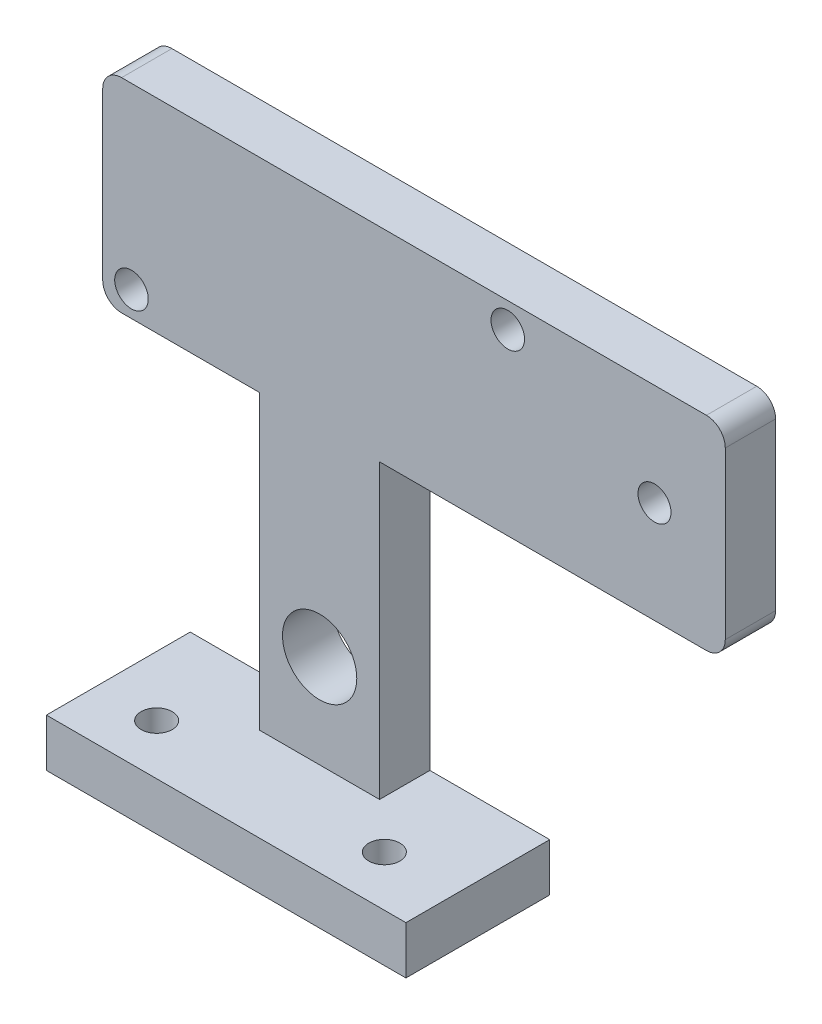
ISO-10303-21;
HEADER;
FILE_DESCRIPTION(('STEP AP214'),'2;1');
FILE_NAME('part.step','',(''),(''),'','','');
FILE_SCHEMA(('AUTOMOTIVE_DESIGN { 1 0 10303 214 1 1 1 1 }'));
ENDSEC;
DATA;
#1=APPLICATION_CONTEXT('core data for automotive mechanical design processes');
#2=APPLICATION_PROTOCOL_DEFINITION('international standard','automotive_design',2000,#1);
#3=PRODUCT_CONTEXT('',#1,'mechanical');
#4=PRODUCT('Part','Part','',(#3));
#5=PRODUCT_RELATED_PRODUCT_CATEGORY('part','',(#4));
#6=PRODUCT_DEFINITION_FORMATION('','',#4);
#7=PRODUCT_DEFINITION_CONTEXT('part definition',#1,'design');
#8=PRODUCT_DEFINITION('design','',#6,#7);
#9=PRODUCT_DEFINITION_SHAPE('','',#8);
#10=(LENGTH_UNIT() NAMED_UNIT(*) SI_UNIT(.MILLI.,.METRE.));
#11=(NAMED_UNIT(*) PLANE_ANGLE_UNIT() SI_UNIT($,.RADIAN.));
#12=(NAMED_UNIT(*) SI_UNIT($,.STERADIAN.) SOLID_ANGLE_UNIT());
#13=UNCERTAINTY_MEASURE_WITH_UNIT(LENGTH_MEASURE(1.E-05),#10,'distance_accuracy_value','');
#14=(GEOMETRIC_REPRESENTATION_CONTEXT(3) GLOBAL_UNCERTAINTY_ASSIGNED_CONTEXT((#13)) GLOBAL_UNIT_ASSIGNED_CONTEXT((#10,
#11,#12)) REPRESENTATION_CONTEXT('',''));
#15=CARTESIAN_POINT('',(0.,0.,0.));
#16=DIRECTION('',(0.,0.,1.));
#17=DIRECTION('',(1.,0.,0.));
#18=AXIS2_PLACEMENT_3D('',#15,#16,#17);
#19=CARTESIAN_POINT('',(-100.96160810836,-5.08,-61.813229454098));
#20=DIRECTION('',(-1.,0.,0.));
#21=DIRECTION('',(0.,0.,1.));
#22=AXIS2_PLACEMENT_3D('',#19,#20,#21);
#23=PLANE('',#22);
#24=DIRECTION('',(0.,0.,1.));
#25=VECTOR('',#24,1.);
#26=CARTESIAN_POINT('',(-100.96160810836,0.,-61.813229454098));
#27=LINE('',#26,#25);
#28=CARTESIAN_POINT('',(-100.96160810836,0.,-61.813229454098));
#29=VERTEX_POINT('',#28);
#30=CARTESIAN_POINT('',(-100.96160810836,0.,-46.573229454098));
#31=VERTEX_POINT('',#30);
#32=EDGE_CURVE('E239',#29,#31,#27,.T.);
#33=ORIENTED_EDGE('',*,*,#32,.F.);
#34=DIRECTION('',(0.,1.,0.));
#35=VECTOR('',#34,1.);
#36=CARTESIAN_POINT('',(-100.96160810836,-5.08,-61.813229454098));
#37=LINE('',#36,#35);
#38=CARTESIAN_POINT('',(-100.96160810836,-5.08,-61.813229454098));
#39=VERTEX_POINT('',#38);
#40=EDGE_CURVE('E216',#39,#29,#37,.T.);
#41=ORIENTED_EDGE('',*,*,#40,.F.);
#42=DIRECTION('',(0.,0.,1.));
#43=VECTOR('',#42,1.);
#44=CARTESIAN_POINT('',(-100.96160810836,-5.08,-61.813229454098));
#45=LINE('',#44,#43);
#46=CARTESIAN_POINT('',(-100.96160810836,-5.08,-46.573229454098));
#47=VERTEX_POINT('',#46);
#48=EDGE_CURVE('E250',#39,#47,#45,.T.);
#49=ORIENTED_EDGE('',*,*,#48,.T.);
#50=DIRECTION('',(0.,1.,0.));
#51=VECTOR('',#50,1.);
#52=CARTESIAN_POINT('',(-100.96160810836,-5.08,-46.573229454098));
#53=LINE('',#52,#51);
#54=EDGE_CURVE('E224',#47,#31,#53,.T.);
#55=ORIENTED_EDGE('',*,*,#54,.T.);
#56=EDGE_LOOP('',(#33,#41,#49,#55));
#57=FACE_BOUND('',#56,.T.);
#58=ADVANCED_FACE('F33',(#57),#23,.T.);
#59=CARTESIAN_POINT('',(-100.96160810836,-5.08,-61.813229454098));
#60=DIRECTION('',(0.,0.,-1.));
#61=DIRECTION('',(-1.,0.,0.));
#62=AXIS2_PLACEMENT_3D('',#59,#60,#61);
#63=PLANE('',#62);
#64=CARTESIAN_POINT('',(-46.42460810836,41.783,-61.813229454098));
#65=DIRECTION('',(0.,0.,-1.));
#66=DIRECTION('',(-1.,0.,0.));
#67=AXIS2_PLACEMENT_3D('',#64,#65,#66);
#68=CIRCLE('',#67,1.75);
#69=CARTESIAN_POINT('',(-48.17460810836,41.783,-61.813229454098));
#70=VERTEX_POINT('',#69);
#71=EDGE_CURVE('E360',#70,#70,#68,.T.);
#72=ORIENTED_EDGE('',*,*,#71,.F.);
#73=EDGE_LOOP('',(#72));
#74=FACE_BOUND('',#73,.T.);
#75=CARTESIAN_POINT('',(-81.91160810836,9.90599999999999,-61.813229454098));
#76=DIRECTION('',(0.,0.,-1.));
#77=DIRECTION('',(-1.,0.,0.));
#78=AXIS2_PLACEMENT_3D('',#75,#76,#77);
#79=CIRCLE('',#78,3.937);
#80=CARTESIAN_POINT('',(-85.84860810836,9.90599999999999,-61.813229454098));
#81=VERTEX_POINT('',#80);
#82=EDGE_CURVE('E358',#81,#81,#79,.T.);
#83=ORIENTED_EDGE('',*,*,#82,.F.);
#84=EDGE_LOOP('',(#83));
#85=FACE_BOUND('',#84,.T.);
#86=CARTESIAN_POINT('',(-61.97260810836,49.911,-61.813229454098));
#87=DIRECTION('',(0.,0.,-1.));
#88=DIRECTION('',(-1.,0.,0.));
#89=AXIS2_PLACEMENT_3D('',#86,#87,#88);
#90=CIRCLE('',#89,1.77800000000001);
#91=CARTESIAN_POINT('',(-63.75060810836,49.911,-61.813229454098));
#92=VERTEX_POINT('',#91);
#93=EDGE_CURVE('E299',#92,#92,#90,.T.);
#94=ORIENTED_EDGE('',*,*,#93,.F.);
#95=EDGE_LOOP('',(#94));
#96=FACE_BOUND('',#95,.T.);
#97=CARTESIAN_POINT('',(-101.85060810836,33.655,-61.813229454098));
#98=DIRECTION('',(0.,0.,-1.));
#99=DIRECTION('',(-1.,0.,0.));
#100=AXIS2_PLACEMENT_3D('',#97,#98,#99);
#101=CIRCLE('',#100,1.77800000000001);
#102=CARTESIAN_POINT('',(-103.62860810836,33.655,-61.813229454098));
#103=VERTEX_POINT('',#102);
#104=EDGE_CURVE('E290',#103,#103,#101,.T.);
#105=ORIENTED_EDGE('',*,*,#104,.F.);
#106=EDGE_LOOP('',(#105));
#107=FACE_BOUND('',#106,.T.);
#108=DIRECTION('',(0.,-1.,0.));
#109=VECTOR('',#108,1.);
#110=CARTESIAN_POINT('',(-104.89860810836,52.578,-61.813229454098));
#111=LINE('',#110,#109);
#112=CARTESIAN_POINT('',(-104.89860810836,50.578,-61.813229454098));
#113=VERTEX_POINT('',#112);
#114=CARTESIAN_POINT('',(-104.89860810836,32.988,-61.813229454098));
#115=VERTEX_POINT('',#114);
#116=EDGE_CURVE('E285',#113,#115,#111,.T.);
#117=ORIENTED_EDGE('',*,*,#116,.F.);
#118=CARTESIAN_POINT('',(-102.89860810836,50.578,-61.813229454098));
#119=DIRECTION('',(0.,0.,-1.));
#120=DIRECTION('',(-1.,0.,0.));
#121=AXIS2_PLACEMENT_3D('',#118,#119,#120);
#122=CIRCLE('',#121,2.);
#123=CARTESIAN_POINT('',(-102.89860810836,52.578,-61.813229454098));
#124=VERTEX_POINT('',#123);
#125=EDGE_CURVE('E41',#113,#124,#122,.T.);
#126=ORIENTED_EDGE('',*,*,#125,.T.);
#127=DIRECTION('',(-1.,0.,0.));
#128=VECTOR('',#127,1.);
#129=CARTESIAN_POINT('',(-104.89860810836,52.578,-61.813229454098));
#130=LINE('',#129,#128);
#131=CARTESIAN_POINT('',(-40.92460810836,52.578,-61.813229454098));
#132=VERTEX_POINT('',#131);
#133=EDGE_CURVE('E303',#132,#124,#130,.T.);
#134=ORIENTED_EDGE('',*,*,#133,.F.);
#135=CARTESIAN_POINT('',(-40.92460810836,50.578,-61.813229454098));
#136=DIRECTION('',(0.,0.,-1.));
#137=DIRECTION('',(-1.,0.,0.));
#138=AXIS2_PLACEMENT_3D('',#135,#136,#137);
#139=CIRCLE('',#138,2.);
#140=CARTESIAN_POINT('',(-38.92460810836,50.578,-61.813229454098));
#141=VERTEX_POINT('',#140);
#142=EDGE_CURVE('E276',#132,#141,#139,.T.);
#143=ORIENTED_EDGE('',*,*,#142,.T.);
#144=DIRECTION('',(0.,1.,0.));
#145=VECTOR('',#144,1.);
#146=CARTESIAN_POINT('',(-38.92460810836,30.988,-61.813229454098));
#147=LINE('',#146,#145);
#148=CARTESIAN_POINT('',(-38.92460810836,32.988,-61.813229454098));
#149=VERTEX_POINT('',#148);
#150=EDGE_CURVE('E354',#149,#141,#147,.T.);
#151=ORIENTED_EDGE('',*,*,#150,.F.);
#152=CARTESIAN_POINT('',(-40.92460810836,32.988,-61.813229454098));
#153=DIRECTION('',(0.,0.,-1.));
#154=DIRECTION('',(-1.,0.,0.));
#155=AXIS2_PLACEMENT_3D('',#152,#153,#154);
#156=CIRCLE('',#155,2.);
#157=CARTESIAN_POINT('',(-40.92460810836,30.988,-61.813229454098));
#158=VERTEX_POINT('',#157);
#159=EDGE_CURVE('E152',#149,#158,#156,.T.);
#160=ORIENTED_EDGE('',*,*,#159,.T.);
#161=DIRECTION('',(-1.,0.,0.));
#162=VECTOR('',#161,1.);
#163=CARTESIAN_POINT('',(-104.89860810836,30.988,-61.813229454098));
#164=LINE('',#163,#162);
#165=CARTESIAN_POINT('',(-75.56160810836,30.988,-61.813229454098));
#166=VERTEX_POINT('',#165);
#167=EDGE_CURVE('E146',#158,#166,#164,.T.);
#168=ORIENTED_EDGE('',*,*,#167,.T.);
#169=DIRECTION('',(0.,-1.,0.));
#170=VECTOR('',#169,1.);
#171=CARTESIAN_POINT('',(-75.56160810836,30.988,-61.813229454098));
#172=LINE('',#171,#170);
#173=CARTESIAN_POINT('',(-75.56160810836,0.,-61.813229454098));
#174=VERTEX_POINT('',#173);
#175=EDGE_CURVE('E150',#166,#174,#172,.T.);
#176=ORIENTED_EDGE('',*,*,#175,.T.);
#177=DIRECTION('',(-1.,0.,0.));
#178=VECTOR('',#177,1.);
#179=CARTESIAN_POINT('',(-100.96160810836,0.,-61.813229454098));
#180=LINE('',#179,#178);
#181=CARTESIAN_POINT('',(-62.86160810836,0.,-61.813229454098));
#182=VERTEX_POINT('',#181);
#183=EDGE_CURVE('E209',#182,#174,#180,.T.);
#184=ORIENTED_EDGE('',*,*,#183,.F.);
#185=DIRECTION('',(0.,1.,0.));
#186=VECTOR('',#185,1.);
#187=CARTESIAN_POINT('',(-62.86160810836,-5.08,-61.813229454098));
#188=LINE('',#187,#186);
#189=CARTESIAN_POINT('',(-62.86160810836,-5.08,-61.813229454098));
#190=VERTEX_POINT('',#189);
#191=EDGE_CURVE('E221',#190,#182,#188,.T.);
#192=ORIENTED_EDGE('',*,*,#191,.F.);
#193=DIRECTION('',(-1.,0.,0.));
#194=VECTOR('',#193,1.);
#195=CARTESIAN_POINT('',(-100.96160810836,-5.08,-61.813229454098));
#196=LINE('',#195,#194);
#197=EDGE_CURVE('E225',#190,#39,#196,.T.);
#198=ORIENTED_EDGE('',*,*,#197,.T.);
#199=ORIENTED_EDGE('',*,*,#40,.T.);
#200=CARTESIAN_POINT('',(-88.26160810836,0.,-61.813229454098));
#201=VERTEX_POINT('',#200);
#202=EDGE_CURVE('E206',#201,#29,#180,.T.);
#203=ORIENTED_EDGE('',*,*,#202,.F.);
#204=DIRECTION('',(0.,-1.,0.));
#205=VECTOR('',#204,1.);
#206=CARTESIAN_POINT('',(-88.26160810836,30.988,-61.813229454098));
#207=LINE('',#206,#205);
#208=CARTESIAN_POINT('',(-88.26160810836,30.988,-61.813229454098));
#209=VERTEX_POINT('',#208);
#210=EDGE_CURVE('E168',#209,#201,#207,.T.);
#211=ORIENTED_EDGE('',*,*,#210,.F.);
#212=CARTESIAN_POINT('',(-102.89860810836,30.988,-61.813229454098));
#213=VERTEX_POINT('',#212);
#214=EDGE_CURVE('E157',#209,#213,#164,.T.);
#215=ORIENTED_EDGE('',*,*,#214,.T.);
#216=CARTESIAN_POINT('',(-102.89860810836,32.988,-61.813229454098));
#217=DIRECTION('',(0.,0.,-1.));
#218=DIRECTION('',(-1.,0.,0.));
#219=AXIS2_PLACEMENT_3D('',#216,#217,#218);
#220=CIRCLE('',#219,2.);
#221=EDGE_CURVE('E53',#213,#115,#220,.T.);
#222=ORIENTED_EDGE('',*,*,#221,.T.);
#223=EDGE_LOOP('',(#117,#126,#134,#143,#151,#160,#168,#176,#184,#192,#198,#199,#203,#211,#215,#222));
#224=FACE_BOUND('',#223,.T.);
#225=ADVANCED_FACE('F148',(#74,#85,#96,#107,#224),#63,.T.);
#226=CARTESIAN_POINT('',(-62.86160810836,-5.08,-61.813229454098));
#227=DIRECTION('',(1.,0.,0.));
#228=DIRECTION('',(0.,0.,-1.));
#229=AXIS2_PLACEMENT_3D('',#226,#227,#228);
#230=PLANE('',#229);
#231=DIRECTION('',(0.,0.,-1.));
#232=VECTOR('',#231,1.);
#233=CARTESIAN_POINT('',(-62.86160810836,0.,-61.813229454098));
#234=LINE('',#233,#232);
#235=CARTESIAN_POINT('',(-62.86160810836,0.,-46.573229454098));
#236=VERTEX_POINT('',#235);
#237=EDGE_CURVE('E210',#236,#182,#234,.T.);
#238=ORIENTED_EDGE('',*,*,#237,.F.);
#239=DIRECTION('',(0.,1.,0.));
#240=VECTOR('',#239,1.);
#241=CARTESIAN_POINT('',(-62.86160810836,-5.08,-46.573229454098));
#242=LINE('',#241,#240);
#243=CARTESIAN_POINT('',(-62.86160810836,-5.08,-46.573229454098));
#244=VERTEX_POINT('',#243);
#245=EDGE_CURVE('E223',#244,#236,#242,.T.);
#246=ORIENTED_EDGE('',*,*,#245,.F.);
#247=DIRECTION('',(0.,0.,-1.));
#248=VECTOR('',#247,1.);
#249=CARTESIAN_POINT('',(-62.86160810836,-5.08,-61.813229454098));
#250=LINE('',#249,#248);
#251=EDGE_CURVE('E231',#244,#190,#250,.T.);
#252=ORIENTED_EDGE('',*,*,#251,.T.);
#253=ORIENTED_EDGE('',*,*,#191,.T.);
#254=EDGE_LOOP('',(#238,#246,#252,#253));
#255=FACE_BOUND('',#254,.T.);
#256=ADVANCED_FACE('F376',(#255),#230,.T.);
#257=CARTESIAN_POINT('',(-100.96160810836,-5.08,-46.573229454098));
#258=DIRECTION('',(0.,0.,1.));
#259=DIRECTION('',(1.,0.,0.));
#260=AXIS2_PLACEMENT_3D('',#257,#258,#259);
#261=PLANE('',#260);
#262=DIRECTION('',(1.,0.,0.));
#263=VECTOR('',#262,1.);
#264=CARTESIAN_POINT('',(-100.96160810836,0.,-46.573229454098));
#265=LINE('',#264,#263);
#266=EDGE_CURVE('E241',#31,#236,#265,.T.);
#267=ORIENTED_EDGE('',*,*,#266,.F.);
#268=ORIENTED_EDGE('',*,*,#54,.F.);
#269=DIRECTION('',(1.,0.,0.));
#270=VECTOR('',#269,1.);
#271=CARTESIAN_POINT('',(-100.96160810836,-5.08,-46.573229454098));
#272=LINE('',#271,#270);
#273=EDGE_CURVE('E235',#47,#244,#272,.T.);
#274=ORIENTED_EDGE('',*,*,#273,.T.);
#275=ORIENTED_EDGE('',*,*,#245,.T.);
#276=EDGE_LOOP('',(#267,#268,#274,#275));
#277=FACE_BOUND('',#276,.T.);
#278=ADVANCED_FACE('F384',(#277),#261,.T.);
#279=CARTESIAN_POINT('',(0.,-5.08,0.));
#280=DIRECTION('',(0.,1.,0.));
#281=DIRECTION('',(0.,0.,1.));
#282=AXIS2_PLACEMENT_3D('',#279,#280,#281);
#283=PLANE('',#282);
#284=CARTESIAN_POINT('',(-70.48160810836,-5.08,-51.907229454098));
#285=DIRECTION('',(0.,1.,0.));
#286=DIRECTION('',(0.,0.,1.));
#287=AXIS2_PLACEMENT_3D('',#284,#285,#286);
#288=CIRCLE('',#287,1.65100000000001);
#289=CARTESIAN_POINT('',(-70.48160810836,-5.08,-50.256229454098));
#290=VERTEX_POINT('',#289);
#291=EDGE_CURVE('E195',#290,#290,#288,.T.);
#292=ORIENTED_EDGE('',*,*,#291,.T.);
#293=EDGE_LOOP('',(#292));
#294=FACE_BOUND('',#293,.T.);
#295=CARTESIAN_POINT('',(-94.61160810836,-5.08,-51.907229454098));
#296=DIRECTION('',(0.,1.,0.));
#297=DIRECTION('',(0.,0.,1.));
#298=AXIS2_PLACEMENT_3D('',#295,#296,#297);
#299=CIRCLE('',#298,1.65100000000001);
#300=CARTESIAN_POINT('',(-94.61160810836,-5.08,-50.256229454098));
#301=VERTEX_POINT('',#300);
#302=EDGE_CURVE('E242',#301,#301,#299,.T.);
#303=ORIENTED_EDGE('',*,*,#302,.T.);
#304=EDGE_LOOP('',(#303));
#305=FACE_BOUND('',#304,.T.);
#306=ORIENTED_EDGE('',*,*,#48,.F.);
#307=ORIENTED_EDGE('',*,*,#197,.F.);
#308=ORIENTED_EDGE('',*,*,#251,.F.);
#309=ORIENTED_EDGE('',*,*,#273,.F.);
#310=EDGE_LOOP('',(#306,#307,#308,#309));
#311=FACE_BOUND('',#310,.T.);
#312=ADVANCED_FACE('F394',(#294,#305,#311),#283,.F.);
#313=CARTESIAN_POINT('',(0.,0.,0.));
#314=DIRECTION('',(0.,1.,0.));
#315=DIRECTION('',(0.,0.,1.));
#316=AXIS2_PLACEMENT_3D('',#313,#314,#315);
#317=PLANE('',#316);
#318=DIRECTION('',(0.,0.,1.));
#319=VECTOR('',#318,1.);
#320=CARTESIAN_POINT('',(-88.26160810836,0.,-61.813229454098));
#321=LINE('',#320,#319);
#322=CARTESIAN_POINT('',(-88.26160810836,0.,-56.479229454098));
#323=VERTEX_POINT('',#322);
#324=EDGE_CURVE('E192',#201,#323,#321,.T.);
#325=ORIENTED_EDGE('',*,*,#324,.F.);
#326=ORIENTED_EDGE('',*,*,#202,.T.);
#327=ORIENTED_EDGE('',*,*,#32,.T.);
#328=ORIENTED_EDGE('',*,*,#266,.T.);
#329=ORIENTED_EDGE('',*,*,#237,.T.);
#330=ORIENTED_EDGE('',*,*,#183,.T.);
#331=DIRECTION('',(0.,0.,-1.));
#332=VECTOR('',#331,1.);
#333=CARTESIAN_POINT('',(-75.56160810836,0.,-61.813229454098));
#334=LINE('',#333,#332);
#335=CARTESIAN_POINT('',(-75.56160810836,0.,-56.479229454098));
#336=VERTEX_POINT('',#335);
#337=EDGE_CURVE('E166',#336,#174,#334,.T.);
#338=ORIENTED_EDGE('',*,*,#337,.F.);
#339=DIRECTION('',(1.,0.,0.));
#340=VECTOR('',#339,1.);
#341=CARTESIAN_POINT('',(-88.26160810836,0.,-56.479229454098));
#342=LINE('',#341,#340);
#343=EDGE_CURVE('E189',#323,#336,#342,.T.);
#344=ORIENTED_EDGE('',*,*,#343,.F.);
#345=EDGE_LOOP('',(#325,#326,#327,#328,#329,#330,#338,#344));
#346=FACE_BOUND('',#345,.T.);
#347=CARTESIAN_POINT('',(-70.48160810836,0.,-51.907229454098));
#348=DIRECTION('',(0.,1.,0.));
#349=DIRECTION('',(0.,0.,1.));
#350=AXIS2_PLACEMENT_3D('',#347,#348,#349);
#351=CIRCLE('',#350,1.65100000000001);
#352=CARTESIAN_POINT('',(-70.48160810836,0.,-50.256229454098));
#353=VERTEX_POINT('',#352);
#354=EDGE_CURVE('E259',#353,#353,#351,.T.);
#355=ORIENTED_EDGE('',*,*,#354,.F.);
#356=EDGE_LOOP('',(#355));
#357=FACE_BOUND('',#356,.T.);
#358=CARTESIAN_POINT('',(-94.61160810836,0.,-51.907229454098));
#359=DIRECTION('',(0.,1.,0.));
#360=DIRECTION('',(0.,0.,1.));
#361=AXIS2_PLACEMENT_3D('',#358,#359,#360);
#362=CIRCLE('',#361,1.65100000000001);
#363=CARTESIAN_POINT('',(-94.61160810836,0.,-50.256229454098));
#364=VERTEX_POINT('',#363);
#365=EDGE_CURVE('E255',#364,#364,#362,.T.);
#366=ORIENTED_EDGE('',*,*,#365,.F.);
#367=EDGE_LOOP('',(#366));
#368=FACE_BOUND('',#367,.T.);
#369=ADVANCED_FACE('F247',(#346,#357,#368),#317,.T.);
#370=CARTESIAN_POINT('',(-94.61160810836,-5.08,-51.907229454098));
#371=DIRECTION('',(0.,1.,0.));
#372=DIRECTION('',(0.,0.,1.));
#373=AXIS2_PLACEMENT_3D('',#370,#371,#372);
#374=CYLINDRICAL_SURFACE('',#373,1.65100000000001);
#375=ORIENTED_EDGE('',*,*,#302,.F.);
#376=EDGE_LOOP('',(#375));
#377=FACE_BOUND('',#376,.T.);
#378=ORIENTED_EDGE('',*,*,#365,.T.);
#379=EDGE_LOOP('',(#378));
#380=FACE_BOUND('',#379,.T.);
#381=ADVANCED_FACE('F504',(#377,#380),#374,.F.);
#382=CARTESIAN_POINT('',(-70.48160810836,-5.08,-51.907229454098));
#383=DIRECTION('',(0.,1.,0.));
#384=DIRECTION('',(0.,0.,1.));
#385=AXIS2_PLACEMENT_3D('',#382,#383,#384);
#386=CYLINDRICAL_SURFACE('',#385,1.65100000000001);
#387=ORIENTED_EDGE('',*,*,#291,.F.);
#388=EDGE_LOOP('',(#387));
#389=FACE_BOUND('',#388,.T.);
#390=ORIENTED_EDGE('',*,*,#354,.T.);
#391=EDGE_LOOP('',(#390));
#392=FACE_BOUND('',#391,.T.);
#393=ADVANCED_FACE('F500',(#389,#392),#386,.F.);
#394=CARTESIAN_POINT('',(-88.26160810836,30.988,-61.813229454098));
#395=DIRECTION('',(1.,0.,0.));
#396=DIRECTION('',(0.,0.,-1.));
#397=AXIS2_PLACEMENT_3D('',#394,#395,#396);
#398=PLANE('',#397);
#399=ORIENTED_EDGE('',*,*,#324,.T.);
#400=DIRECTION('',(0.,-1.,0.));
#401=VECTOR('',#400,1.);
#402=CARTESIAN_POINT('',(-88.26160810836,30.988,-56.479229454098));
#403=LINE('',#402,#401);
#404=CARTESIAN_POINT('',(-88.26160810836,30.988,-56.479229454098));
#405=VERTEX_POINT('',#404);
#406=EDGE_CURVE('E261',#405,#323,#403,.T.);
#407=ORIENTED_EDGE('',*,*,#406,.F.);
#408=DIRECTION('',(0.,0.,1.));
#409=VECTOR('',#408,1.);
#410=CARTESIAN_POINT('',(-88.26160810836,30.988,-61.813229454098));
#411=LINE('',#410,#409);
#412=EDGE_CURVE('E173',#209,#405,#411,.T.);
#413=ORIENTED_EDGE('',*,*,#412,.F.);
#414=ORIENTED_EDGE('',*,*,#210,.T.);
#415=EDGE_LOOP('',(#399,#407,#413,#414));
#416=FACE_BOUND('',#415,.T.);
#417=ADVANCED_FACE('F445',(#416),#398,.F.);
#418=CARTESIAN_POINT('',(-88.26160810836,30.988,-56.479229454098));
#419=DIRECTION('',(0.,0.,-1.));
#420=DIRECTION('',(-1.,0.,0.));
#421=AXIS2_PLACEMENT_3D('',#418,#419,#420);
#422=PLANE('',#421);
#423=CARTESIAN_POINT('',(-46.42460810836,41.783,-56.479229454098));
#424=DIRECTION('',(0.,0.,1.));
#425=DIRECTION('',(1.,0.,0.));
#426=AXIS2_PLACEMENT_3D('',#423,#424,#425);
#427=CIRCLE('',#426,1.75);
#428=CARTESIAN_POINT('',(-44.67460810836,41.783,-56.479229454098));
#429=VERTEX_POINT('',#428);
#430=EDGE_CURVE('E631',#429,#429,#427,.T.);
#431=ORIENTED_EDGE('',*,*,#430,.F.);
#432=EDGE_LOOP('',(#431));
#433=FACE_BOUND('',#432,.T.);
#434=CARTESIAN_POINT('',(-81.91160810836,9.90599999999999,-56.479229454098));
#435=DIRECTION('',(0.,0.,1.));
#436=DIRECTION('',(1.,0.,0.));
#437=AXIS2_PLACEMENT_3D('',#434,#435,#436);
#438=CIRCLE('',#437,3.937);
#439=CARTESIAN_POINT('',(-77.97460810836,9.90599999999999,-56.479229454098));
#440=VERTEX_POINT('',#439);
#441=EDGE_CURVE('E355',#440,#440,#438,.T.);
#442=ORIENTED_EDGE('',*,*,#441,.F.);
#443=EDGE_LOOP('',(#442));
#444=FACE_BOUND('',#443,.T.);
#445=CARTESIAN_POINT('',(-61.97260810836,49.911,-56.479229454098));
#446=DIRECTION('',(0.,0.,1.));
#447=DIRECTION('',(1.,0.,0.));
#448=AXIS2_PLACEMENT_3D('',#445,#446,#447);
#449=CIRCLE('',#448,1.77800000000001);
#450=CARTESIAN_POINT('',(-60.19460810836,49.911,-56.479229454098));
#451=VERTEX_POINT('',#450);
#452=EDGE_CURVE('E366',#451,#451,#449,.T.);
#453=ORIENTED_EDGE('',*,*,#452,.F.);
#454=EDGE_LOOP('',(#453));
#455=FACE_BOUND('',#454,.T.);
#456=CARTESIAN_POINT('',(-101.85060810836,33.655,-56.479229454098));
#457=DIRECTION('',(0.,0.,1.));
#458=DIRECTION('',(1.,0.,0.));
#459=AXIS2_PLACEMENT_3D('',#456,#457,#458);
#460=CIRCLE('',#459,1.77800000000001);
#461=CARTESIAN_POINT('',(-100.07260810836,33.655,-56.479229454098));
#462=VERTEX_POINT('',#461);
#463=EDGE_CURVE('E294',#462,#462,#460,.T.);
#464=ORIENTED_EDGE('',*,*,#463,.F.);
#465=EDGE_LOOP('',(#464));
#466=FACE_BOUND('',#465,.T.);
#467=DIRECTION('',(1.,0.,0.));
#468=VECTOR('',#467,1.);
#469=CARTESIAN_POINT('',(-104.89860810836,52.578,-56.479229454098));
#470=LINE('',#469,#468);
#471=CARTESIAN_POINT('',(-102.89860810836,52.578,-56.479229454098));
#472=VERTEX_POINT('',#471);
#473=CARTESIAN_POINT('',(-40.92460810836,52.578,-56.479229454098));
#474=VERTEX_POINT('',#473);
#475=EDGE_CURVE('E156',#472,#474,#470,.T.);
#476=ORIENTED_EDGE('',*,*,#475,.F.);
#477=CARTESIAN_POINT('',(-102.89860810836,50.578,-56.479229454098));
#478=DIRECTION('',(0.,0.,-1.));
#479=DIRECTION('',(-1.,0.,0.));
#480=AXIS2_PLACEMENT_3D('',#477,#478,#479);
#481=CIRCLE('',#480,2.);
#482=CARTESIAN_POINT('',(-104.89860810836,50.578,-56.479229454098));
#483=VERTEX_POINT('',#482);
#484=EDGE_CURVE('E317',#472,#483,#481,.F.);
#485=ORIENTED_EDGE('',*,*,#484,.T.);
#486=DIRECTION('',(0.,-1.,0.));
#487=VECTOR('',#486,1.);
#488=CARTESIAN_POINT('',(-104.89860810836,52.578,-56.479229454098));
#489=LINE('',#488,#487);
#490=CARTESIAN_POINT('',(-104.89860810836,32.988,-56.479229454098));
#491=VERTEX_POINT('',#490);
#492=EDGE_CURVE('E205',#483,#491,#489,.T.);
#493=ORIENTED_EDGE('',*,*,#492,.T.);
#494=CARTESIAN_POINT('',(-102.89860810836,32.988,-56.479229454098));
#495=DIRECTION('',(0.,0.,-1.));
#496=DIRECTION('',(-1.,0.,0.));
#497=AXIS2_PLACEMENT_3D('',#494,#495,#496);
#498=CIRCLE('',#497,2.);
#499=CARTESIAN_POINT('',(-102.89860810836,30.988,-56.479229454098));
#500=VERTEX_POINT('',#499);
#501=EDGE_CURVE('E316',#491,#500,#498,.F.);
#502=ORIENTED_EDGE('',*,*,#501,.T.);
#503=DIRECTION('',(1.,0.,0.));
#504=VECTOR('',#503,1.);
#505=CARTESIAN_POINT('',(-104.89860810836,30.988,-56.479229454098));
#506=LINE('',#505,#504);
#507=EDGE_CURVE('E289',#500,#405,#506,.T.);
#508=ORIENTED_EDGE('',*,*,#507,.T.);
#509=ORIENTED_EDGE('',*,*,#406,.T.);
#510=ORIENTED_EDGE('',*,*,#343,.T.);
#511=DIRECTION('',(0.,-1.,0.));
#512=VECTOR('',#511,1.);
#513=CARTESIAN_POINT('',(-75.56160810836,30.988,-56.479229454098));
#514=LINE('',#513,#512);
#515=CARTESIAN_POINT('',(-75.56160810836,30.988,-56.479229454098));
#516=VERTEX_POINT('',#515);
#517=EDGE_CURVE('E167',#516,#336,#514,.T.);
#518=ORIENTED_EDGE('',*,*,#517,.F.);
#519=CARTESIAN_POINT('',(-40.92460810836,30.988,-56.479229454098));
#520=VERTEX_POINT('',#519);
#521=EDGE_CURVE('E172',#516,#520,#506,.T.);
#522=ORIENTED_EDGE('',*,*,#521,.T.);
#523=CARTESIAN_POINT('',(-40.92460810836,32.988,-56.479229454098));
#524=DIRECTION('',(0.,0.,-1.));
#525=DIRECTION('',(-1.,0.,0.));
#526=AXIS2_PLACEMENT_3D('',#523,#524,#525);
#527=CIRCLE('',#526,2.);
#528=CARTESIAN_POINT('',(-38.92460810836,32.988,-56.479229454098));
#529=VERTEX_POINT('',#528);
#530=EDGE_CURVE('E342',#520,#529,#527,.F.);
#531=ORIENTED_EDGE('',*,*,#530,.T.);
#532=DIRECTION('',(0.,-1.,0.));
#533=VECTOR('',#532,1.);
#534=CARTESIAN_POINT('',(-38.92460810836,30.988,-56.479229454098));
#535=LINE('',#534,#533);
#536=CARTESIAN_POINT('',(-38.92460810836,50.578,-56.479229454098));
#537=VERTEX_POINT('',#536);
#538=EDGE_CURVE('E350',#537,#529,#535,.T.);
#539=ORIENTED_EDGE('',*,*,#538,.F.);
#540=CARTESIAN_POINT('',(-40.92460810836,50.578,-56.479229454098));
#541=DIRECTION('',(0.,0.,-1.));
#542=DIRECTION('',(-1.,0.,0.));
#543=AXIS2_PLACEMENT_3D('',#540,#541,#542);
#544=CIRCLE('',#543,2.);
#545=EDGE_CURVE('E337',#537,#474,#544,.F.);
#546=ORIENTED_EDGE('',*,*,#545,.T.);
#547=EDGE_LOOP('',(#476,#485,#493,#502,#508,#509,#510,#518,#522,#531,#539,#546));
#548=FACE_BOUND('',#547,.T.);
#549=ADVANCED_FACE('F315',(#433,#444,#455,#466,#548),#422,.F.);
#550=CARTESIAN_POINT('',(-75.56160810836,30.988,-61.813229454098));
#551=DIRECTION('',(-1.,0.,0.));
#552=DIRECTION('',(0.,0.,1.));
#553=AXIS2_PLACEMENT_3D('',#550,#551,#552);
#554=PLANE('',#553);
#555=ORIENTED_EDGE('',*,*,#337,.T.);
#556=ORIENTED_EDGE('',*,*,#175,.F.);
#557=DIRECTION('',(0.,0.,-1.));
#558=VECTOR('',#557,1.);
#559=CARTESIAN_POINT('',(-75.56160810836,30.988,-61.813229454098));
#560=LINE('',#559,#558);
#561=EDGE_CURVE('E164',#516,#166,#560,.T.);
#562=ORIENTED_EDGE('',*,*,#561,.F.);
#563=ORIENTED_EDGE('',*,*,#517,.T.);
#564=EDGE_LOOP('',(#555,#556,#562,#563));
#565=FACE_BOUND('',#564,.T.);
#566=ADVANCED_FACE('F162',(#565),#554,.F.);
#567=CARTESIAN_POINT('',(0.,30.988,0.));
#568=DIRECTION('',(0.,1.,0.));
#569=DIRECTION('',(0.,0.,1.));
#570=AXIS2_PLACEMENT_3D('',#567,#568,#569);
#571=PLANE('',#570);
#572=ORIENTED_EDGE('',*,*,#507,.F.);
#573=DIRECTION('',(0.,0.,1.));
#574=VECTOR('',#573,1.);
#575=CARTESIAN_POINT('',(-102.89860810836,30.988,0.));
#576=LINE('',#575,#574);
#577=EDGE_CURVE('E11',#500,#213,#576,.F.);
#578=ORIENTED_EDGE('',*,*,#577,.T.);
#579=ORIENTED_EDGE('',*,*,#214,.F.);
#580=ORIENTED_EDGE('',*,*,#412,.T.);
#581=EDGE_LOOP('',(#572,#578,#579,#580));
#582=FACE_BOUND('',#581,.T.);
#583=ADVANCED_FACE('F437',(#582),#571,.F.);
#584=ORIENTED_EDGE('',*,*,#167,.F.);
#585=DIRECTION('',(0.,0.,-1.));
#586=VECTOR('',#585,1.);
#587=CARTESIAN_POINT('',(-40.9246081083601,30.988,0.));
#588=LINE('',#587,#586);
#589=EDGE_CURVE('E336',#158,#520,#588,.F.);
#590=ORIENTED_EDGE('',*,*,#589,.T.);
#591=ORIENTED_EDGE('',*,*,#521,.F.);
#592=ORIENTED_EDGE('',*,*,#561,.T.);
#593=EDGE_LOOP('',(#584,#590,#591,#592));
#594=FACE_BOUND('',#593,.T.);
#595=ADVANCED_FACE('F170',(#594),#571,.F.);
#596=CARTESIAN_POINT('',(-104.89860810836,52.578,-61.813229454098));
#597=DIRECTION('',(1.,0.,0.));
#598=DIRECTION('',(0.,0.,-1.));
#599=AXIS2_PLACEMENT_3D('',#596,#597,#598);
#600=PLANE('',#599);
#601=ORIENTED_EDGE('',*,*,#492,.F.);
#602=DIRECTION('',(0.,0.,1.));
#603=VECTOR('',#602,1.);
#604=CARTESIAN_POINT('',(-104.89860810836,50.578,-61.813229454098));
#605=LINE('',#604,#603);
#606=EDGE_CURVE('E320',#483,#113,#605,.F.);
#607=ORIENTED_EDGE('',*,*,#606,.T.);
#608=ORIENTED_EDGE('',*,*,#116,.T.);
#609=DIRECTION('',(0.,0.,1.));
#610=VECTOR('',#609,1.);
#611=CARTESIAN_POINT('',(-104.89860810836,32.988,-61.813229454098));
#612=LINE('',#611,#610);
#613=EDGE_CURVE('E321',#115,#491,#612,.T.);
#614=ORIENTED_EDGE('',*,*,#613,.T.);
#615=EDGE_LOOP('',(#601,#607,#608,#614));
#616=FACE_BOUND('',#615,.T.);
#617=ADVANCED_FACE('F319',(#616),#600,.F.);
#618=CARTESIAN_POINT('',(0.,52.578,0.));
#619=DIRECTION('',(0.,1.,0.));
#620=DIRECTION('',(0.,0.,1.));
#621=AXIS2_PLACEMENT_3D('',#618,#619,#620);
#622=PLANE('',#621);
#623=ORIENTED_EDGE('',*,*,#133,.T.);
#624=DIRECTION('',(0.,0.,1.));
#625=VECTOR('',#624,1.);
#626=CARTESIAN_POINT('',(-102.89860810836,52.578,-56.479229454098));
#627=LINE('',#626,#625);
#628=EDGE_CURVE('E345',#124,#472,#627,.T.);
#629=ORIENTED_EDGE('',*,*,#628,.T.);
#630=ORIENTED_EDGE('',*,*,#475,.T.);
#631=DIRECTION('',(0.,0.,1.));
#632=VECTOR('',#631,1.);
#633=CARTESIAN_POINT('',(-40.92460810836,52.578,-61.813229454098));
#634=LINE('',#633,#632);
#635=EDGE_CURVE('E335',#474,#132,#634,.F.);
#636=ORIENTED_EDGE('',*,*,#635,.T.);
#637=EDGE_LOOP('',(#623,#629,#630,#636));
#638=FACE_BOUND('',#637,.T.);
#639=ADVANCED_FACE('F347',(#638),#622,.T.);
#640=CARTESIAN_POINT('',(-101.85060810836,33.655,-61.813279454098));
#641=DIRECTION('',(0.,0.,1.));
#642=DIRECTION('',(1.,0.,0.));
#643=AXIS2_PLACEMENT_3D('',#640,#641,#642);
#644=CYLINDRICAL_SURFACE('',#643,1.77800000000001);
#645=ORIENTED_EDGE('',*,*,#104,.T.);
#646=EDGE_LOOP('',(#645));
#647=FACE_BOUND('',#646,.T.);
#648=ORIENTED_EDGE('',*,*,#463,.T.);
#649=EDGE_LOOP('',(#648));
#650=FACE_BOUND('',#649,.T.);
#651=ADVANCED_FACE('F423',(#647,#650),#644,.F.);
#652=CARTESIAN_POINT('',(-61.97260810836,49.911,-61.813279454098));
#653=DIRECTION('',(0.,0.,1.));
#654=DIRECTION('',(1.,0.,0.));
#655=AXIS2_PLACEMENT_3D('',#652,#653,#654);
#656=CYLINDRICAL_SURFACE('',#655,1.77800000000001);
#657=ORIENTED_EDGE('',*,*,#93,.T.);
#658=EDGE_LOOP('',(#657));
#659=FACE_BOUND('',#658,.T.);
#660=ORIENTED_EDGE('',*,*,#452,.T.);
#661=EDGE_LOOP('',(#660));
#662=FACE_BOUND('',#661,.T.);
#663=ADVANCED_FACE('F371',(#659,#662),#656,.F.);
#664=CARTESIAN_POINT('',(-81.91160810836,9.90599999999999,-61.813279454098));
#665=DIRECTION('',(0.,0.,1.));
#666=DIRECTION('',(1.,0.,0.));
#667=AXIS2_PLACEMENT_3D('',#664,#665,#666);
#668=CYLINDRICAL_SURFACE('',#667,3.937);
#669=ORIENTED_EDGE('',*,*,#82,.T.);
#670=EDGE_LOOP('',(#669));
#671=FACE_BOUND('',#670,.T.);
#672=ORIENTED_EDGE('',*,*,#441,.T.);
#673=EDGE_LOOP('',(#672));
#674=FACE_BOUND('',#673,.T.);
#675=ADVANCED_FACE('F472',(#671,#674),#668,.F.);
#676=CARTESIAN_POINT('',(-38.9246081083601,0.,0.));
#677=DIRECTION('',(-1.,0.,0.));
#678=DIRECTION('',(0.,0.,1.));
#679=AXIS2_PLACEMENT_3D('',#676,#677,#678);
#680=PLANE('',#679);
#681=ORIENTED_EDGE('',*,*,#538,.T.);
#682=DIRECTION('',(0.,0.,-1.));
#683=VECTOR('',#682,1.);
#684=CARTESIAN_POINT('',(-38.9246081083601,32.988,0.));
#685=LINE('',#684,#683);
#686=EDGE_CURVE('E274',#529,#149,#685,.T.);
#687=ORIENTED_EDGE('',*,*,#686,.T.);
#688=ORIENTED_EDGE('',*,*,#150,.T.);
#689=DIRECTION('',(0.,0.,1.));
#690=VECTOR('',#689,1.);
#691=CARTESIAN_POINT('',(-38.92460810836,50.578,-56.479229454098));
#692=LINE('',#691,#690);
#693=EDGE_CURVE('E220',#141,#537,#692,.T.);
#694=ORIENTED_EDGE('',*,*,#693,.T.);
#695=EDGE_LOOP('',(#681,#687,#688,#694));
#696=FACE_BOUND('',#695,.T.);
#697=ADVANCED_FACE('F352',(#696),#680,.F.);
#698=CARTESIAN_POINT('',(-46.42460810836,41.783,-61.813279454098));
#699=DIRECTION('',(0.,0.,1.));
#700=DIRECTION('',(1.,0.,0.));
#701=AXIS2_PLACEMENT_3D('',#698,#699,#700);
#702=CYLINDRICAL_SURFACE('',#701,1.75);
#703=ORIENTED_EDGE('',*,*,#71,.T.);
#704=EDGE_LOOP('',(#703));
#705=FACE_BOUND('',#704,.T.);
#706=ORIENTED_EDGE('',*,*,#430,.T.);
#707=EDGE_LOOP('',(#706));
#708=FACE_BOUND('',#707,.T.);
#709=ADVANCED_FACE('F400',(#705,#708),#702,.F.);
#710=CARTESIAN_POINT('',(-40.9246081083601,32.988,0.));
#711=DIRECTION('',(0.,0.,-1.));
#712=DIRECTION('',(-1.,0.,0.));
#713=AXIS2_PLACEMENT_3D('',#710,#711,#712);
#714=CYLINDRICAL_SURFACE('',#713,2.);
#715=ORIENTED_EDGE('',*,*,#530,.F.);
#716=ORIENTED_EDGE('',*,*,#589,.F.);
#717=ORIENTED_EDGE('',*,*,#159,.F.);
#718=ORIENTED_EDGE('',*,*,#686,.F.);
#719=EDGE_LOOP('',(#715,#716,#717,#718));
#720=FACE_BOUND('',#719,.T.);
#721=ADVANCED_FACE('F397',(#720),#714,.T.);
#722=CARTESIAN_POINT('',(-40.9246081083601,50.578,0.));
#723=DIRECTION('',(0.,0.,-1.));
#724=DIRECTION('',(-1.,0.,0.));
#725=AXIS2_PLACEMENT_3D('',#722,#723,#724);
#726=CYLINDRICAL_SURFACE('',#725,2.);
#727=ORIENTED_EDGE('',*,*,#142,.F.);
#728=ORIENTED_EDGE('',*,*,#635,.F.);
#729=ORIENTED_EDGE('',*,*,#545,.F.);
#730=ORIENTED_EDGE('',*,*,#693,.F.);
#731=EDGE_LOOP('',(#727,#728,#729,#730));
#732=FACE_BOUND('',#731,.T.);
#733=ADVANCED_FACE('F334',(#732),#726,.T.);
#734=CARTESIAN_POINT('',(-102.89860810836,50.578,0.));
#735=DIRECTION('',(0.,0.,-1.));
#736=DIRECTION('',(-1.,0.,0.));
#737=AXIS2_PLACEMENT_3D('',#734,#735,#736);
#738=CYLINDRICAL_SURFACE('',#737,2.);
#739=ORIENTED_EDGE('',*,*,#125,.F.);
#740=ORIENTED_EDGE('',*,*,#606,.F.);
#741=ORIENTED_EDGE('',*,*,#484,.F.);
#742=ORIENTED_EDGE('',*,*,#628,.F.);
#743=EDGE_LOOP('',(#739,#740,#741,#742));
#744=FACE_BOUND('',#743,.T.);
#745=ADVANCED_FACE('F324',(#744),#738,.T.);
#746=CARTESIAN_POINT('',(-102.89860810836,32.988,-61.813229454098));
#747=DIRECTION('',(0.,0.,1.));
#748=DIRECTION('',(1.,0.,0.));
#749=AXIS2_PLACEMENT_3D('',#746,#747,#748);
#750=CYLINDRICAL_SURFACE('',#749,2.);
#751=ORIENTED_EDGE('',*,*,#221,.F.);
#752=ORIENTED_EDGE('',*,*,#577,.F.);
#753=ORIENTED_EDGE('',*,*,#501,.F.);
#754=ORIENTED_EDGE('',*,*,#613,.F.);
#755=EDGE_LOOP('',(#751,#752,#753,#754));
#756=FACE_BOUND('',#755,.T.);
#757=ADVANCED_FACE('F35',(#756),#750,.T.);
#758=CLOSED_SHELL('',(#58,#225,#256,#278,#312,#369,#381,#393,#417,#549,#566,#583,#595,#617,#639,
#651,#663,#675,#697,#709,#721,#733,#745,#757));
#759=MANIFOLD_SOLID_BREP('B2',#758);
#760=ADVANCED_BREP_SHAPE_REPRESENTATION('',(#18,#759),#14);
#761=SHAPE_DEFINITION_REPRESENTATION(#9,#760);
ENDSEC;
END-ISO-10303-21;
